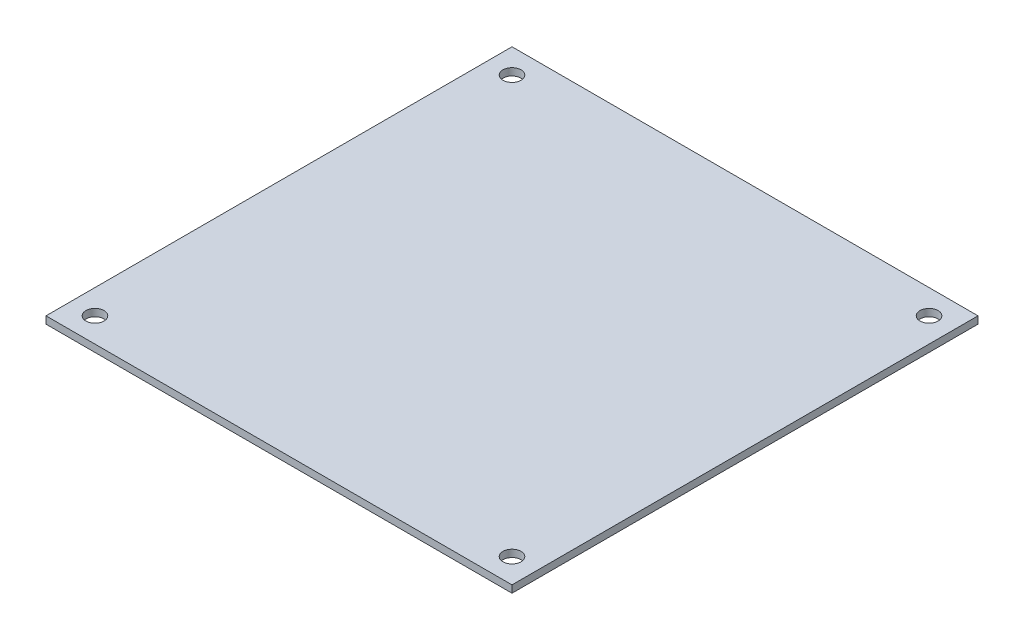
ISO-10303-21;
HEADER;
FILE_DESCRIPTION(('STEP AP214'),'2;1');
FILE_NAME('part.step','',(''),(''),'','','');
FILE_SCHEMA(('AUTOMOTIVE_DESIGN { 1 0 10303 214 1 1 1 1 }'));
ENDSEC;
DATA;
#1=APPLICATION_CONTEXT('core data for automotive mechanical design processes');
#2=APPLICATION_PROTOCOL_DEFINITION('international standard','automotive_design',2000,#1);
#3=PRODUCT_CONTEXT('',#1,'mechanical');
#4=PRODUCT('Part','Part','',(#3));
#5=PRODUCT_RELATED_PRODUCT_CATEGORY('part','',(#4));
#6=PRODUCT_DEFINITION_FORMATION('','',#4);
#7=PRODUCT_DEFINITION_CONTEXT('part definition',#1,'design');
#8=PRODUCT_DEFINITION('design','',#6,#7);
#9=PRODUCT_DEFINITION_SHAPE('','',#8);
#10=(LENGTH_UNIT() NAMED_UNIT(*) SI_UNIT(.MILLI.,.METRE.));
#11=(NAMED_UNIT(*) PLANE_ANGLE_UNIT() SI_UNIT($,.RADIAN.));
#12=(NAMED_UNIT(*) SI_UNIT($,.STERADIAN.) SOLID_ANGLE_UNIT());
#13=UNCERTAINTY_MEASURE_WITH_UNIT(LENGTH_MEASURE(1.E-05),#10,'distance_accuracy_value','');
#14=(GEOMETRIC_REPRESENTATION_CONTEXT(3) GLOBAL_UNCERTAINTY_ASSIGNED_CONTEXT((#13)) GLOBAL_UNIT_ASSIGNED_CONTEXT((#10,
#11,#12)) REPRESENTATION_CONTEXT('',''));
#15=CARTESIAN_POINT('',(0.,0.,0.));
#16=DIRECTION('',(0.,0.,1.));
#17=DIRECTION('',(1.,0.,0.));
#18=AXIS2_PLACEMENT_3D('',#15,#16,#17);
#19=CARTESIAN_POINT('',(0.,10.,0.));
#20=DIRECTION('',(0.,1.,0.));
#21=DIRECTION('',(0.,0.,1.));
#22=AXIS2_PLACEMENT_3D('',#19,#20,#21);
#23=PLANE('',#22);
#24=CARTESIAN_POINT('',(574.999999999999,10.,575.));
#25=DIRECTION('',(0.,1.,0.));
#26=DIRECTION('',(0.,0.,1.));
#27=AXIS2_PLACEMENT_3D('',#24,#25,#26);
#28=CIRCLE('',#27,25.);
#29=CARTESIAN_POINT('',(574.999999999999,10.,600.));
#30=VERTEX_POINT('',#29);
#31=EDGE_CURVE('E121',#30,#30,#28,.T.);
#32=ORIENTED_EDGE('',*,*,#31,.F.);
#33=EDGE_LOOP('',(#32));
#34=FACE_BOUND('',#33,.T.);
#35=CARTESIAN_POINT('',(-575.,10.,-575.));
#36=DIRECTION('',(0.,1.,0.));
#37=DIRECTION('',(0.,0.,1.));
#38=AXIS2_PLACEMENT_3D('',#35,#36,#37);
#39=CIRCLE('',#38,25.);
#40=CARTESIAN_POINT('',(-575.,10.,-550.));
#41=VERTEX_POINT('',#40);
#42=EDGE_CURVE('E100',#41,#41,#39,.T.);
#43=ORIENTED_EDGE('',*,*,#42,.F.);
#44=EDGE_LOOP('',(#43));
#45=FACE_BOUND('',#44,.T.);
#46=DIRECTION('',(0.,0.,-1.));
#47=VECTOR('',#46,1.);
#48=CARTESIAN_POINT('',(642.5,10.,-642.5));
#49=LINE('',#48,#47);
#50=CARTESIAN_POINT('',(642.5,10.,642.5));
#51=VERTEX_POINT('',#50);
#52=CARTESIAN_POINT('',(642.5,10.,-642.5));
#53=VERTEX_POINT('',#52);
#54=EDGE_CURVE('E85',#51,#53,#49,.T.);
#55=ORIENTED_EDGE('',*,*,#54,.T.);
#56=DIRECTION('',(-1.,0.,0.));
#57=VECTOR('',#56,1.);
#58=CARTESIAN_POINT('',(-642.5,10.,-642.5));
#59=LINE('',#58,#57);
#60=CARTESIAN_POINT('',(-642.5,10.,-642.5));
#61=VERTEX_POINT('',#60);
#62=EDGE_CURVE('E80',#53,#61,#59,.T.);
#63=ORIENTED_EDGE('',*,*,#62,.T.);
#64=DIRECTION('',(0.,0.,1.));
#65=VECTOR('',#64,1.);
#66=CARTESIAN_POINT('',(-642.5,10.,-642.5));
#67=LINE('',#66,#65);
#68=CARTESIAN_POINT('',(-642.5,10.,642.5));
#69=VERTEX_POINT('',#68);
#70=EDGE_CURVE('E83',#61,#69,#67,.T.);
#71=ORIENTED_EDGE('',*,*,#70,.T.);
#72=DIRECTION('',(1.,0.,0.));
#73=VECTOR('',#72,1.);
#74=CARTESIAN_POINT('',(-642.5,10.,642.5));
#75=LINE('',#74,#73);
#76=EDGE_CURVE('E50',#69,#51,#75,.T.);
#77=ORIENTED_EDGE('',*,*,#76,.T.);
#78=EDGE_LOOP('',(#55,#63,#71,#77));
#79=FACE_BOUND('',#78,.T.);
#80=CARTESIAN_POINT('',(575.,10.,-575.));
#81=DIRECTION('',(0.,1.,0.));
#82=DIRECTION('',(0.,0.,-1.));
#83=AXIS2_PLACEMENT_3D('',#80,#81,#82);
#84=CIRCLE('',#83,25.);
#85=CARTESIAN_POINT('',(575.,10.,-600.));
#86=VERTEX_POINT('',#85);
#87=EDGE_CURVE('E115',#86,#86,#84,.T.);
#88=ORIENTED_EDGE('',*,*,#87,.F.);
#89=EDGE_LOOP('',(#88));
#90=FACE_BOUND('',#89,.T.);
#91=CARTESIAN_POINT('',(-575.,10.,575.));
#92=DIRECTION('',(0.,1.,0.));
#93=DIRECTION('',(0.,0.,-1.));
#94=AXIS2_PLACEMENT_3D('',#91,#92,#93);
#95=CIRCLE('',#94,24.9999999999998);
#96=CARTESIAN_POINT('',(-575.,10.,550.));
#97=VERTEX_POINT('',#96);
#98=EDGE_CURVE('E127',#97,#97,#95,.T.);
#99=ORIENTED_EDGE('',*,*,#98,.F.);
#100=EDGE_LOOP('',(#99));
#101=FACE_BOUND('',#100,.T.);
#102=ADVANCED_FACE('F33',(#34,#45,#79,#90,#101),#23,.T.);
#103=CARTESIAN_POINT('',(0.,-10.,0.));
#104=DIRECTION('',(0.,1.,0.));
#105=DIRECTION('',(0.,0.,1.));
#106=AXIS2_PLACEMENT_3D('',#103,#104,#105);
#107=PLANE('',#106);
#108=DIRECTION('',(0.,0.,-1.));
#109=VECTOR('',#108,1.);
#110=CARTESIAN_POINT('',(642.5,-10.,-642.5));
#111=LINE('',#110,#109);
#112=CARTESIAN_POINT('',(642.5,-10.,642.5));
#113=VERTEX_POINT('',#112);
#114=CARTESIAN_POINT('',(642.5,-10.,-642.5));
#115=VERTEX_POINT('',#114);
#116=EDGE_CURVE('E97',#113,#115,#111,.T.);
#117=ORIENTED_EDGE('',*,*,#116,.F.);
#118=DIRECTION('',(1.,0.,0.));
#119=VECTOR('',#118,1.);
#120=CARTESIAN_POINT('',(-642.5,-10.,642.5));
#121=LINE('',#120,#119);
#122=CARTESIAN_POINT('',(-642.5,-10.,642.5));
#123=VERTEX_POINT('',#122);
#124=EDGE_CURVE('E73',#123,#113,#121,.T.);
#125=ORIENTED_EDGE('',*,*,#124,.F.);
#126=DIRECTION('',(0.,0.,1.));
#127=VECTOR('',#126,1.);
#128=CARTESIAN_POINT('',(-642.5,-10.,-642.5));
#129=LINE('',#128,#127);
#130=CARTESIAN_POINT('',(-642.5,-10.,-642.5));
#131=VERTEX_POINT('',#130);
#132=EDGE_CURVE('E67',#131,#123,#129,.T.);
#133=ORIENTED_EDGE('',*,*,#132,.F.);
#134=DIRECTION('',(-1.,0.,0.));
#135=VECTOR('',#134,1.);
#136=CARTESIAN_POINT('',(-642.5,-10.,-642.5));
#137=LINE('',#136,#135);
#138=EDGE_CURVE('E89',#115,#131,#137,.T.);
#139=ORIENTED_EDGE('',*,*,#138,.F.);
#140=EDGE_LOOP('',(#117,#125,#133,#139));
#141=FACE_BOUND('',#140,.T.);
#142=CARTESIAN_POINT('',(-575.,-10.,-575.));
#143=DIRECTION('',(0.,1.,0.));
#144=DIRECTION('',(0.,0.,1.));
#145=AXIS2_PLACEMENT_3D('',#142,#143,#144);
#146=CIRCLE('',#145,25.);
#147=CARTESIAN_POINT('',(-575.,-10.,-550.));
#148=VERTEX_POINT('',#147);
#149=EDGE_CURVE('E112',#148,#148,#146,.T.);
#150=ORIENTED_EDGE('',*,*,#149,.T.);
#151=EDGE_LOOP('',(#150));
#152=FACE_BOUND('',#151,.T.);
#153=CARTESIAN_POINT('',(575.,-10.,-575.));
#154=DIRECTION('',(0.,1.,0.));
#155=DIRECTION('',(0.,0.,-1.));
#156=AXIS2_PLACEMENT_3D('',#153,#154,#155);
#157=CIRCLE('',#156,25.);
#158=CARTESIAN_POINT('',(575.,-10.,-600.));
#159=VERTEX_POINT('',#158);
#160=EDGE_CURVE('E118',#159,#159,#157,.T.);
#161=ORIENTED_EDGE('',*,*,#160,.T.);
#162=EDGE_LOOP('',(#161));
#163=FACE_BOUND('',#162,.T.);
#164=CARTESIAN_POINT('',(574.999999999999,-10.,575.));
#165=DIRECTION('',(0.,1.,0.));
#166=DIRECTION('',(0.,0.,1.));
#167=AXIS2_PLACEMENT_3D('',#164,#165,#166);
#168=CIRCLE('',#167,25.);
#169=CARTESIAN_POINT('',(574.999999999999,-10.,600.));
#170=VERTEX_POINT('',#169);
#171=EDGE_CURVE('E124',#170,#170,#168,.T.);
#172=ORIENTED_EDGE('',*,*,#171,.T.);
#173=EDGE_LOOP('',(#172));
#174=FACE_BOUND('',#173,.T.);
#175=CARTESIAN_POINT('',(-575.,-10.,575.));
#176=DIRECTION('',(0.,1.,0.));
#177=DIRECTION('',(0.,0.,-1.));
#178=AXIS2_PLACEMENT_3D('',#175,#176,#177);
#179=CIRCLE('',#178,24.9999999999998);
#180=CARTESIAN_POINT('',(-575.,-10.,550.));
#181=VERTEX_POINT('',#180);
#182=EDGE_CURVE('E130',#181,#181,#179,.T.);
#183=ORIENTED_EDGE('',*,*,#182,.T.);
#184=EDGE_LOOP('',(#183));
#185=FACE_BOUND('',#184,.T.);
#186=ADVANCED_FACE('F108',(#141,#152,#163,#174,#185),#107,.F.);
#187=CARTESIAN_POINT('',(642.5,10.,-642.5));
#188=DIRECTION('',(-1.,0.,0.));
#189=DIRECTION('',(0.,0.,1.));
#190=AXIS2_PLACEMENT_3D('',#187,#188,#189);
#191=PLANE('',#190);
#192=ORIENTED_EDGE('',*,*,#116,.T.);
#193=DIRECTION('',(0.,-1.,0.));
#194=VECTOR('',#193,1.);
#195=CARTESIAN_POINT('',(642.5,10.,-642.5));
#196=LINE('',#195,#194);
#197=EDGE_CURVE('E11',#53,#115,#196,.T.);
#198=ORIENTED_EDGE('',*,*,#197,.F.);
#199=ORIENTED_EDGE('',*,*,#54,.F.);
#200=DIRECTION('',(0.,-1.,0.));
#201=VECTOR('',#200,1.);
#202=CARTESIAN_POINT('',(642.5,10.,642.5));
#203=LINE('',#202,#201);
#204=EDGE_CURVE('E93',#51,#113,#203,.T.);
#205=ORIENTED_EDGE('',*,*,#204,.T.);
#206=EDGE_LOOP('',(#192,#198,#199,#205));
#207=FACE_BOUND('',#206,.T.);
#208=ADVANCED_FACE('F35',(#207),#191,.F.);
#209=CARTESIAN_POINT('',(-642.5,10.,-642.5));
#210=DIRECTION('',(0.,0.,1.));
#211=DIRECTION('',(1.,0.,0.));
#212=AXIS2_PLACEMENT_3D('',#209,#210,#211);
#213=PLANE('',#212);
#214=ORIENTED_EDGE('',*,*,#138,.T.);
#215=DIRECTION('',(0.,-1.,0.));
#216=VECTOR('',#215,1.);
#217=CARTESIAN_POINT('',(-642.5,10.,-642.5));
#218=LINE('',#217,#216);
#219=EDGE_CURVE('E42',#61,#131,#218,.T.);
#220=ORIENTED_EDGE('',*,*,#219,.F.);
#221=ORIENTED_EDGE('',*,*,#62,.F.);
#222=ORIENTED_EDGE('',*,*,#197,.T.);
#223=EDGE_LOOP('',(#214,#220,#221,#222));
#224=FACE_BOUND('',#223,.T.);
#225=ADVANCED_FACE('F88',(#224),#213,.F.);
#226=CARTESIAN_POINT('',(-642.5,10.,-642.5));
#227=DIRECTION('',(1.,0.,0.));
#228=DIRECTION('',(0.,0.,-1.));
#229=AXIS2_PLACEMENT_3D('',#226,#227,#228);
#230=PLANE('',#229);
#231=ORIENTED_EDGE('',*,*,#132,.T.);
#232=DIRECTION('',(0.,-1.,0.));
#233=VECTOR('',#232,1.);
#234=CARTESIAN_POINT('',(-642.5,10.,642.5));
#235=LINE('',#234,#233);
#236=EDGE_CURVE('E90',#69,#123,#235,.T.);
#237=ORIENTED_EDGE('',*,*,#236,.F.);
#238=ORIENTED_EDGE('',*,*,#70,.F.);
#239=ORIENTED_EDGE('',*,*,#219,.T.);
#240=EDGE_LOOP('',(#231,#237,#238,#239));
#241=FACE_BOUND('',#240,.T.);
#242=ADVANCED_FACE('F91',(#241),#230,.F.);
#243=CARTESIAN_POINT('',(-642.5,10.,642.5));
#244=DIRECTION('',(0.,0.,-1.));
#245=DIRECTION('',(-1.,0.,0.));
#246=AXIS2_PLACEMENT_3D('',#243,#244,#245);
#247=PLANE('',#246);
#248=ORIENTED_EDGE('',*,*,#124,.T.);
#249=ORIENTED_EDGE('',*,*,#204,.F.);
#250=ORIENTED_EDGE('',*,*,#76,.F.);
#251=ORIENTED_EDGE('',*,*,#236,.T.);
#252=EDGE_LOOP('',(#248,#249,#250,#251));
#253=FACE_BOUND('',#252,.T.);
#254=ADVANCED_FACE('F105',(#253),#247,.F.);
#255=CARTESIAN_POINT('',(-575.,10.,-575.));
#256=DIRECTION('',(0.,-1.,0.));
#257=DIRECTION('',(0.,0.,-1.));
#258=AXIS2_PLACEMENT_3D('',#255,#256,#257);
#259=CYLINDRICAL_SURFACE('',#258,25.);
#260=ORIENTED_EDGE('',*,*,#42,.T.);
#261=EDGE_LOOP('',(#260));
#262=FACE_BOUND('',#261,.T.);
#263=ORIENTED_EDGE('',*,*,#149,.F.);
#264=EDGE_LOOP('',(#263));
#265=FACE_BOUND('',#264,.T.);
#266=ADVANCED_FACE('F149',(#262,#265),#259,.F.);
#267=CARTESIAN_POINT('',(575.,10.,-575.));
#268=DIRECTION('',(0.,-1.,0.));
#269=DIRECTION('',(0.,0.,-1.));
#270=AXIS2_PLACEMENT_3D('',#267,#268,#269);
#271=CYLINDRICAL_SURFACE('',#270,25.);
#272=ORIENTED_EDGE('',*,*,#87,.T.);
#273=EDGE_LOOP('',(#272));
#274=FACE_BOUND('',#273,.T.);
#275=ORIENTED_EDGE('',*,*,#160,.F.);
#276=EDGE_LOOP('',(#275));
#277=FACE_BOUND('',#276,.T.);
#278=ADVANCED_FACE('F195',(#274,#277),#271,.F.);
#279=CARTESIAN_POINT('',(574.999999999999,10.,575.));
#280=DIRECTION('',(0.,-1.,0.));
#281=DIRECTION('',(0.,0.,-1.));
#282=AXIS2_PLACEMENT_3D('',#279,#280,#281);
#283=CYLINDRICAL_SURFACE('',#282,25.);
#284=ORIENTED_EDGE('',*,*,#31,.T.);
#285=EDGE_LOOP('',(#284));
#286=FACE_BOUND('',#285,.T.);
#287=ORIENTED_EDGE('',*,*,#171,.F.);
#288=EDGE_LOOP('',(#287));
#289=FACE_BOUND('',#288,.T.);
#290=ADVANCED_FACE('F203',(#286,#289),#283,.F.);
#291=CARTESIAN_POINT('',(-575.,10.,575.));
#292=DIRECTION('',(0.,-1.,0.));
#293=DIRECTION('',(0.,0.,-1.));
#294=AXIS2_PLACEMENT_3D('',#291,#292,#293);
#295=CYLINDRICAL_SURFACE('',#294,24.9999999999998);
#296=ORIENTED_EDGE('',*,*,#98,.T.);
#297=EDGE_LOOP('',(#296));
#298=FACE_BOUND('',#297,.T.);
#299=ORIENTED_EDGE('',*,*,#182,.F.);
#300=EDGE_LOOP('',(#299));
#301=FACE_BOUND('',#300,.T.);
#302=ADVANCED_FACE('F136',(#298,#301),#295,.F.);
#303=CLOSED_SHELL('',(#102,#186,#208,#225,#242,#254,#266,#278,#290,#302));
#304=MANIFOLD_SOLID_BREP('B2',#303);
#305=ADVANCED_BREP_SHAPE_REPRESENTATION('',(#18,#304),#14);
#306=SHAPE_DEFINITION_REPRESENTATION(#9,#305);
ENDSEC;
END-ISO-10303-21;
